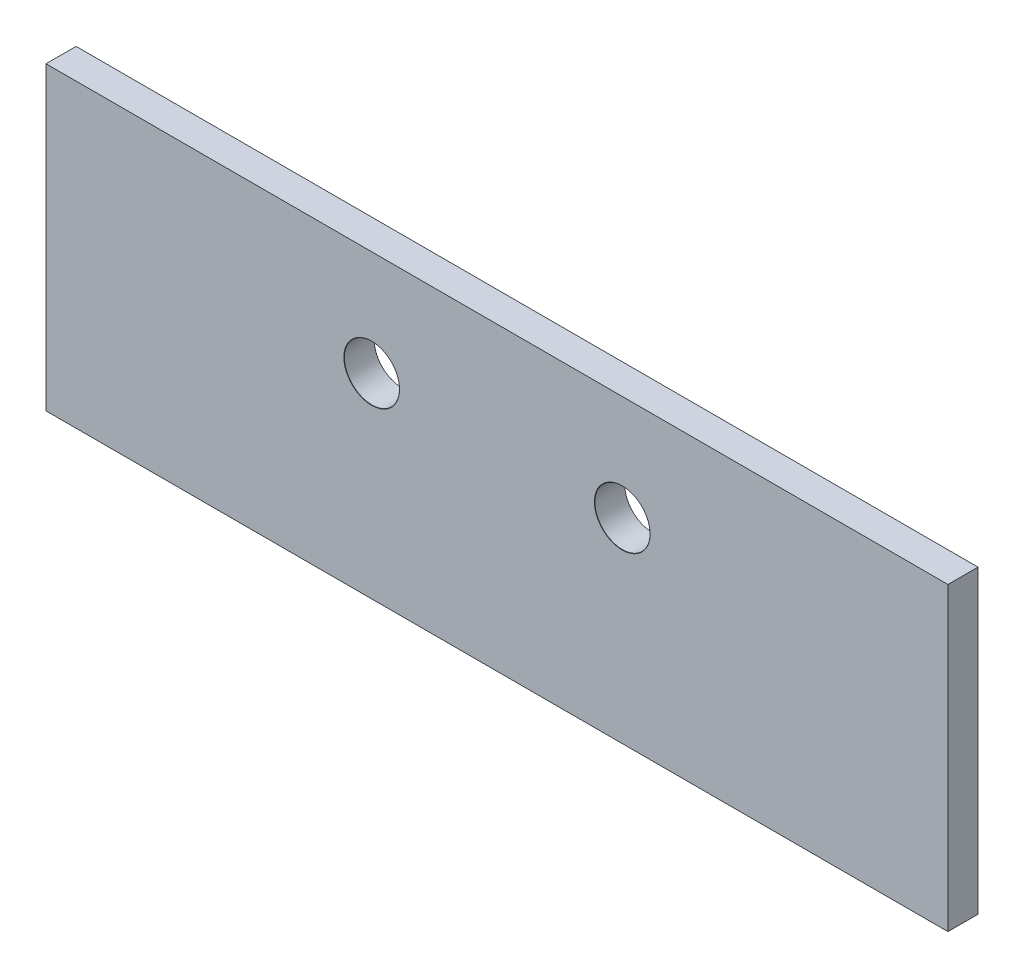
ISO-10303-21;
HEADER;
FILE_DESCRIPTION(('STEP AP214'),'2;1');
FILE_NAME('part.step','',(''),(''),'','','');
FILE_SCHEMA(('AUTOMOTIVE_DESIGN { 1 0 10303 214 1 1 1 1 }'));
ENDSEC;
DATA;
#1=APPLICATION_CONTEXT('core data for automotive mechanical design processes');
#2=APPLICATION_PROTOCOL_DEFINITION('international standard','automotive_design',2000,#1);
#3=PRODUCT_CONTEXT('',#1,'mechanical');
#4=PRODUCT('Part','Part','',(#3));
#5=PRODUCT_RELATED_PRODUCT_CATEGORY('part','',(#4));
#6=PRODUCT_DEFINITION_FORMATION('','',#4);
#7=PRODUCT_DEFINITION_CONTEXT('part definition',#1,'design');
#8=PRODUCT_DEFINITION('design','',#6,#7);
#9=PRODUCT_DEFINITION_SHAPE('','',#8);
#10=(LENGTH_UNIT() NAMED_UNIT(*) SI_UNIT(.MILLI.,.METRE.));
#11=(NAMED_UNIT(*) PLANE_ANGLE_UNIT() SI_UNIT($,.RADIAN.));
#12=(NAMED_UNIT(*) SI_UNIT($,.STERADIAN.) SOLID_ANGLE_UNIT());
#13=UNCERTAINTY_MEASURE_WITH_UNIT(LENGTH_MEASURE(1.E-05),#10,'distance_accuracy_value','');
#14=(GEOMETRIC_REPRESENTATION_CONTEXT(3) GLOBAL_UNCERTAINTY_ASSIGNED_CONTEXT((#13)) GLOBAL_UNIT_ASSIGNED_CONTEXT((#10,
#11,#12)) REPRESENTATION_CONTEXT('',''));
#15=CARTESIAN_POINT('',(0.,0.,0.));
#16=DIRECTION('',(0.,0.,1.));
#17=DIRECTION('',(1.,0.,0.));
#18=AXIS2_PLACEMENT_3D('',#15,#16,#17);
#19=CARTESIAN_POINT('',(-45.,15.,1.5));
#20=DIRECTION('',(1.,0.,0.));
#21=DIRECTION('',(0.,1.,0.));
#22=AXIS2_PLACEMENT_3D('',#19,#20,#21);
#23=PLANE('',#22);
#24=DIRECTION('',(0.,-1.,0.));
#25=VECTOR('',#24,1.);
#26=CARTESIAN_POINT('',(-45.,15.,-1.5));
#27=LINE('',#26,#25);
#28=CARTESIAN_POINT('',(-45.,15.,-1.5));
#29=VERTEX_POINT('',#28);
#30=CARTESIAN_POINT('',(-45.,-15.,-1.5));
#31=VERTEX_POINT('',#30);
#32=EDGE_CURVE('E115',#29,#31,#27,.T.);
#33=ORIENTED_EDGE('',*,*,#32,.T.);
#34=DIRECTION('',(0.,0.,-1.));
#35=VECTOR('',#34,1.);
#36=CARTESIAN_POINT('',(-45.,-15.,1.5));
#37=LINE('',#36,#35);
#38=CARTESIAN_POINT('',(-45.,-15.,1.5));
#39=VERTEX_POINT('',#38);
#40=EDGE_CURVE('E11',#39,#31,#37,.T.);
#41=ORIENTED_EDGE('',*,*,#40,.F.);
#42=DIRECTION('',(0.,-1.,0.));
#43=VECTOR('',#42,1.);
#44=CARTESIAN_POINT('',(-45.,15.,1.5));
#45=LINE('',#44,#43);
#46=CARTESIAN_POINT('',(-45.,15.,1.5));
#47=VERTEX_POINT('',#46);
#48=EDGE_CURVE('E92',#47,#39,#45,.T.);
#49=ORIENTED_EDGE('',*,*,#48,.F.);
#50=DIRECTION('',(0.,0.,-1.));
#51=VECTOR('',#50,1.);
#52=CARTESIAN_POINT('',(-45.,15.,1.5));
#53=LINE('',#52,#51);
#54=EDGE_CURVE('E107',#47,#29,#53,.T.);
#55=ORIENTED_EDGE('',*,*,#54,.T.);
#56=EDGE_LOOP('',(#33,#41,#49,#55));
#57=FACE_BOUND('',#56,.T.);
#58=ADVANCED_FACE('F43',(#57),#23,.F.);
#59=CARTESIAN_POINT('',(45.,-15.,1.5));
#60=DIRECTION('',(0.,1.,0.));
#61=DIRECTION('',(-1.,0.,0.));
#62=AXIS2_PLACEMENT_3D('',#59,#60,#61);
#63=PLANE('',#62);
#64=DIRECTION('',(1.,0.,0.));
#65=VECTOR('',#64,1.);
#66=CARTESIAN_POINT('',(45.,-15.,-1.5));
#67=LINE('',#66,#65);
#68=CARTESIAN_POINT('',(45.,-15.,-1.5));
#69=VERTEX_POINT('',#68);
#70=EDGE_CURVE('E99',#31,#69,#67,.T.);
#71=ORIENTED_EDGE('',*,*,#70,.T.);
#72=DIRECTION('',(0.,0.,-1.));
#73=VECTOR('',#72,1.);
#74=CARTESIAN_POINT('',(45.,-15.,1.5));
#75=LINE('',#74,#73);
#76=CARTESIAN_POINT('',(45.,-15.,1.5));
#77=VERTEX_POINT('',#76);
#78=EDGE_CURVE('E55',#77,#69,#75,.T.);
#79=ORIENTED_EDGE('',*,*,#78,.F.);
#80=DIRECTION('',(1.,0.,0.));
#81=VECTOR('',#80,1.);
#82=CARTESIAN_POINT('',(45.,-15.,1.5));
#83=LINE('',#82,#81);
#84=EDGE_CURVE('E89',#39,#77,#83,.T.);
#85=ORIENTED_EDGE('',*,*,#84,.F.);
#86=ORIENTED_EDGE('',*,*,#40,.T.);
#87=EDGE_LOOP('',(#71,#79,#85,#86));
#88=FACE_BOUND('',#87,.T.);
#89=ADVANCED_FACE('F97',(#88),#63,.F.);
#90=CARTESIAN_POINT('',(45.,15.,1.5));
#91=DIRECTION('',(-1.,0.,0.));
#92=DIRECTION('',(0.,-1.,0.));
#93=AXIS2_PLACEMENT_3D('',#90,#91,#92);
#94=PLANE('',#93);
#95=DIRECTION('',(0.,1.,0.));
#96=VECTOR('',#95,1.);
#97=CARTESIAN_POINT('',(45.,15.,-1.5));
#98=LINE('',#97,#96);
#99=CARTESIAN_POINT('',(45.,15.,-1.5));
#100=VERTEX_POINT('',#99);
#101=EDGE_CURVE('E80',#69,#100,#98,.T.);
#102=ORIENTED_EDGE('',*,*,#101,.T.);
#103=DIRECTION('',(0.,0.,-1.));
#104=VECTOR('',#103,1.);
#105=CARTESIAN_POINT('',(45.,15.,1.5));
#106=LINE('',#105,#104);
#107=CARTESIAN_POINT('',(45.,15.,1.5));
#108=VERTEX_POINT('',#107);
#109=EDGE_CURVE('E105',#108,#100,#106,.T.);
#110=ORIENTED_EDGE('',*,*,#109,.F.);
#111=DIRECTION('',(0.,1.,0.));
#112=VECTOR('',#111,1.);
#113=CARTESIAN_POINT('',(45.,15.,1.5));
#114=LINE('',#113,#112);
#115=EDGE_CURVE('E91',#77,#108,#114,.T.);
#116=ORIENTED_EDGE('',*,*,#115,.F.);
#117=ORIENTED_EDGE('',*,*,#78,.T.);
#118=EDGE_LOOP('',(#102,#110,#116,#117));
#119=FACE_BOUND('',#118,.T.);
#120=ADVANCED_FACE('F103',(#119),#94,.F.);
#121=CARTESIAN_POINT('',(45.,15.,1.5));
#122=DIRECTION('',(0.,-1.,0.));
#123=DIRECTION('',(1.,0.,0.));
#124=AXIS2_PLACEMENT_3D('',#121,#122,#123);
#125=PLANE('',#124);
#126=DIRECTION('',(-1.,0.,0.));
#127=VECTOR('',#126,1.);
#128=CARTESIAN_POINT('',(45.,15.,-1.5));
#129=LINE('',#128,#127);
#130=EDGE_CURVE('E81',#100,#29,#129,.T.);
#131=ORIENTED_EDGE('',*,*,#130,.T.);
#132=ORIENTED_EDGE('',*,*,#54,.F.);
#133=DIRECTION('',(-1.,0.,0.));
#134=VECTOR('',#133,1.);
#135=CARTESIAN_POINT('',(45.,15.,1.5));
#136=LINE('',#135,#134);
#137=EDGE_CURVE('E58',#108,#47,#136,.T.);
#138=ORIENTED_EDGE('',*,*,#137,.F.);
#139=ORIENTED_EDGE('',*,*,#109,.T.);
#140=EDGE_LOOP('',(#131,#132,#138,#139));
#141=FACE_BOUND('',#140,.T.);
#142=ADVANCED_FACE('F130',(#141),#125,.F.);
#143=CARTESIAN_POINT('',(0.,0.,1.5));
#144=DIRECTION('',(0.,0.,-1.));
#145=DIRECTION('',(-1.,0.,0.));
#146=AXIS2_PLACEMENT_3D('',#143,#144,#145);
#147=PLANE('',#146);
#148=CARTESIAN_POINT('',(-12.5,4.5,1.5));
#149=DIRECTION('',(0.,0.,1.));
#150=DIRECTION('',(1.,0.,0.));
#151=AXIS2_PLACEMENT_3D('',#148,#149,#150);
#152=CIRCLE('',#151,2.775);
#153=CARTESIAN_POINT('',(-9.725,4.5,1.5));
#154=VERTEX_POINT('',#153);
#155=EDGE_CURVE('E152',#154,#154,#152,.T.);
#156=ORIENTED_EDGE('',*,*,#155,.F.);
#157=EDGE_LOOP('',(#156));
#158=FACE_BOUND('',#157,.T.);
#159=CARTESIAN_POINT('',(12.5,4.5,1.5));
#160=DIRECTION('',(0.,0.,1.));
#161=DIRECTION('',(1.,0.,0.));
#162=AXIS2_PLACEMENT_3D('',#159,#160,#161);
#163=CIRCLE('',#162,2.775);
#164=CARTESIAN_POINT('',(15.275,4.5,1.5));
#165=VERTEX_POINT('',#164);
#166=EDGE_CURVE('E142',#165,#165,#163,.T.);
#167=ORIENTED_EDGE('',*,*,#166,.F.);
#168=EDGE_LOOP('',(#167));
#169=FACE_BOUND('',#168,.T.);
#170=ORIENTED_EDGE('',*,*,#48,.T.);
#171=ORIENTED_EDGE('',*,*,#84,.T.);
#172=ORIENTED_EDGE('',*,*,#115,.T.);
#173=ORIENTED_EDGE('',*,*,#137,.T.);
#174=EDGE_LOOP('',(#170,#171,#172,#173));
#175=FACE_BOUND('',#174,.T.);
#176=ADVANCED_FACE('F93',(#158,#169,#175),#147,.F.);
#177=CARTESIAN_POINT('',(0.,0.,-1.5));
#178=DIRECTION('',(0.,0.,-1.));
#179=DIRECTION('',(-1.,0.,0.));
#180=AXIS2_PLACEMENT_3D('',#177,#178,#179);
#181=PLANE('',#180);
#182=CARTESIAN_POINT('',(-12.5,4.5,-1.5));
#183=DIRECTION('',(0.,0.,1.));
#184=DIRECTION('',(1.,0.,0.));
#185=AXIS2_PLACEMENT_3D('',#182,#183,#184);
#186=CIRCLE('',#185,2.75);
#187=CARTESIAN_POINT('',(-9.75,4.5,-1.5));
#188=VERTEX_POINT('',#187);
#189=EDGE_CURVE('E148',#188,#188,#186,.T.);
#190=ORIENTED_EDGE('',*,*,#189,.T.);
#191=EDGE_LOOP('',(#190));
#192=FACE_BOUND('',#191,.T.);
#193=CARTESIAN_POINT('',(12.5,4.5,-1.5));
#194=DIRECTION('',(0.,0.,1.));
#195=DIRECTION('',(1.,0.,0.));
#196=AXIS2_PLACEMENT_3D('',#193,#194,#195);
#197=CIRCLE('',#196,2.75);
#198=CARTESIAN_POINT('',(15.25,4.5,-1.5));
#199=VERTEX_POINT('',#198);
#200=EDGE_CURVE('E119',#199,#199,#197,.T.);
#201=ORIENTED_EDGE('',*,*,#200,.T.);
#202=EDGE_LOOP('',(#201));
#203=FACE_BOUND('',#202,.T.);
#204=ORIENTED_EDGE('',*,*,#32,.F.);
#205=ORIENTED_EDGE('',*,*,#130,.F.);
#206=ORIENTED_EDGE('',*,*,#101,.F.);
#207=ORIENTED_EDGE('',*,*,#70,.F.);
#208=EDGE_LOOP('',(#204,#205,#206,#207));
#209=FACE_BOUND('',#208,.T.);
#210=ADVANCED_FACE('F128',(#192,#203,#209),#181,.T.);
#211=CARTESIAN_POINT('',(12.5,4.5,1.5));
#212=DIRECTION('',(0.,0.,1.));
#213=DIRECTION('',(1.,0.,0.));
#214=AXIS2_PLACEMENT_3D('',#211,#212,#213);
#215=CYLINDRICAL_SURFACE('',#214,2.75);
#216=ORIENTED_EDGE('',*,*,#200,.F.);
#217=EDGE_LOOP('',(#216));
#218=FACE_BOUND('',#217,.T.);
#219=CARTESIAN_POINT('',(12.5,4.5,1.475));
#220=DIRECTION('',(0.,0.,1.));
#221=DIRECTION('',(1.,0.,0.));
#222=AXIS2_PLACEMENT_3D('',#219,#220,#221);
#223=CIRCLE('',#222,2.75);
#224=CARTESIAN_POINT('',(15.25,4.5,1.475));
#225=VERTEX_POINT('',#224);
#226=EDGE_CURVE('E136',#225,#225,#223,.T.);
#227=ORIENTED_EDGE('',*,*,#226,.T.);
#228=EDGE_LOOP('',(#227));
#229=FACE_BOUND('',#228,.T.);
#230=ADVANCED_FACE('F168',(#218,#229),#215,.F.);
#231=CARTESIAN_POINT('',(12.5,4.5,1.5));
#232=DIRECTION('',(0.,0.,1.));
#233=DIRECTION('',(1.,0.,0.));
#234=AXIS2_PLACEMENT_3D('',#231,#232,#233);
#235=CONICAL_SURFACE('',#234,2.775,0.785398163397336);
#236=ORIENTED_EDGE('',*,*,#226,.F.);
#237=EDGE_LOOP('',(#236));
#238=FACE_BOUND('',#237,.T.);
#239=ORIENTED_EDGE('',*,*,#166,.T.);
#240=EDGE_LOOP('',(#239));
#241=FACE_BOUND('',#240,.T.);
#242=ADVANCED_FACE('F170',(#238,#241),#235,.F.);
#243=CARTESIAN_POINT('',(-12.5,4.5,1.5));
#244=DIRECTION('',(0.,0.,1.));
#245=DIRECTION('',(1.,0.,0.));
#246=AXIS2_PLACEMENT_3D('',#243,#244,#245);
#247=CYLINDRICAL_SURFACE('',#246,2.75);
#248=ORIENTED_EDGE('',*,*,#189,.F.);
#249=EDGE_LOOP('',(#248));
#250=FACE_BOUND('',#249,.T.);
#251=CARTESIAN_POINT('',(-12.5,4.5,1.475));
#252=DIRECTION('',(0.,0.,1.));
#253=DIRECTION('',(1.,0.,0.));
#254=AXIS2_PLACEMENT_3D('',#251,#252,#253);
#255=CIRCLE('',#254,2.75);
#256=CARTESIAN_POINT('',(-9.75,4.5,1.475));
#257=VERTEX_POINT('',#256);
#258=EDGE_CURVE('E147',#257,#257,#255,.T.);
#259=ORIENTED_EDGE('',*,*,#258,.T.);
#260=EDGE_LOOP('',(#259));
#261=FACE_BOUND('',#260,.T.);
#262=ADVANCED_FACE('F166',(#250,#261),#247,.F.);
#263=CARTESIAN_POINT('',(-12.5,4.5,1.5));
#264=DIRECTION('',(0.,0.,1.));
#265=DIRECTION('',(1.,0.,0.));
#266=AXIS2_PLACEMENT_3D('',#263,#264,#265);
#267=CONICAL_SURFACE('',#266,2.775,0.785398163397336);
#268=ORIENTED_EDGE('',*,*,#258,.F.);
#269=EDGE_LOOP('',(#268));
#270=FACE_BOUND('',#269,.T.);
#271=ORIENTED_EDGE('',*,*,#155,.T.);
#272=EDGE_LOOP('',(#271));
#273=FACE_BOUND('',#272,.T.);
#274=ADVANCED_FACE('F159',(#270,#273),#267,.F.);
#275=CLOSED_SHELL('',(#58,#89,#120,#142,#176,#210,#230,#242,#262,#274));
#276=MANIFOLD_SOLID_BREP('B2',#275);
#277=ADVANCED_BREP_SHAPE_REPRESENTATION('',(#18,#276),#14);
#278=SHAPE_DEFINITION_REPRESENTATION(#9,#277);
ENDSEC;
END-ISO-10303-21;
